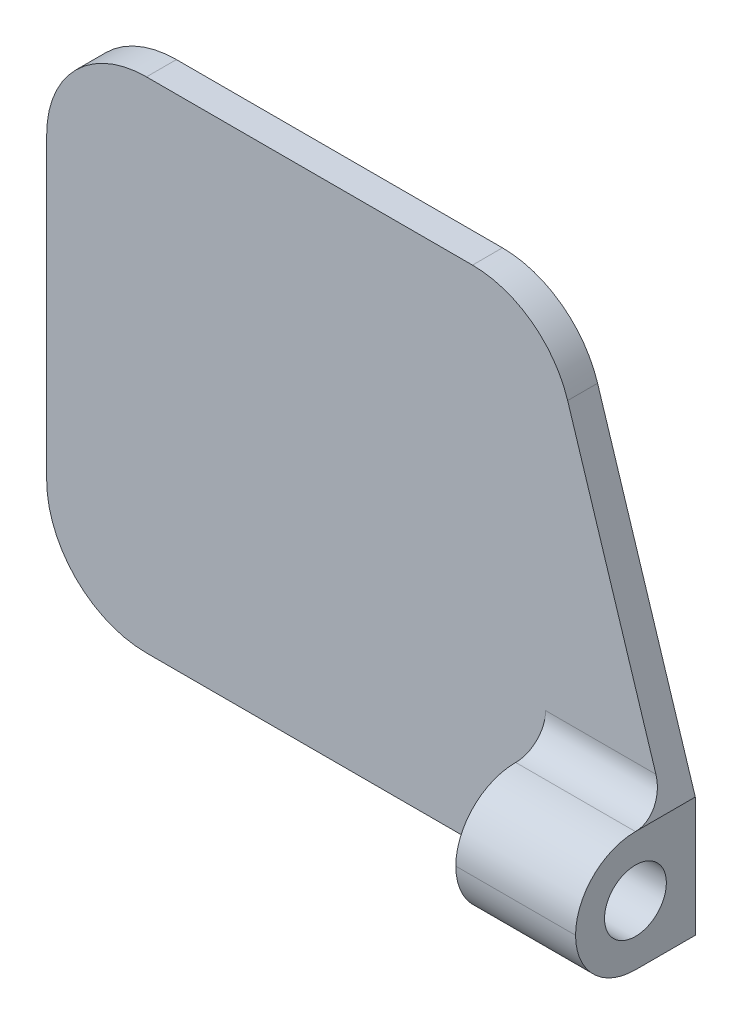
ISO-10303-21;
HEADER;
FILE_DESCRIPTION(('STEP AP214'),'2;1');
FILE_NAME('part.step','',(''),(''),'','','');
FILE_SCHEMA(('AUTOMOTIVE_DESIGN { 1 0 10303 214 1 1 1 1 }'));
ENDSEC;
DATA;
#1=APPLICATION_CONTEXT('core data for automotive mechanical design processes');
#2=APPLICATION_PROTOCOL_DEFINITION('international standard','automotive_design',2000,#1);
#3=PRODUCT_CONTEXT('',#1,'mechanical');
#4=PRODUCT('Part','Part','',(#3));
#5=PRODUCT_RELATED_PRODUCT_CATEGORY('part','',(#4));
#6=PRODUCT_DEFINITION_FORMATION('','',#4);
#7=PRODUCT_DEFINITION_CONTEXT('part definition',#1,'design');
#8=PRODUCT_DEFINITION('design','',#6,#7);
#9=PRODUCT_DEFINITION_SHAPE('','',#8);
#10=(LENGTH_UNIT() NAMED_UNIT(*) SI_UNIT(.MILLI.,.METRE.));
#11=(NAMED_UNIT(*) PLANE_ANGLE_UNIT() SI_UNIT($,.RADIAN.));
#12=(NAMED_UNIT(*) SI_UNIT($,.STERADIAN.) SOLID_ANGLE_UNIT());
#13=UNCERTAINTY_MEASURE_WITH_UNIT(LENGTH_MEASURE(1.E-05),#10,'distance_accuracy_value','');
#14=(GEOMETRIC_REPRESENTATION_CONTEXT(3) GLOBAL_UNCERTAINTY_ASSIGNED_CONTEXT((#13)) GLOBAL_UNIT_ASSIGNED_CONTEXT((#10,
#11,#12)) REPRESENTATION_CONTEXT('',''));
#15=CARTESIAN_POINT('',(0.,0.,0.));
#16=DIRECTION('',(0.,0.,1.));
#17=DIRECTION('',(1.,0.,0.));
#18=AXIS2_PLACEMENT_3D('',#15,#16,#17);
#19=CARTESIAN_POINT('',(0.,0.,3.));
#20=DIRECTION('',(0.,0.,-1.));
#21=DIRECTION('',(-1.,0.,0.));
#22=AXIS2_PLACEMENT_3D('',#19,#20,#21);
#23=PLANE('',#22);
#24=DIRECTION('',(0.,-1.,0.));
#25=VECTOR('',#24,1.);
#26=CARTESIAN_POINT('',(0.,0.,3.));
#27=LINE('',#26,#25);
#28=CARTESIAN_POINT('',(0.,40.,3.));
#29=VERTEX_POINT('',#28);
#30=CARTESIAN_POINT('',(0.,10.,3.));
#31=VERTEX_POINT('',#30);
#32=EDGE_CURVE('E156',#29,#31,#27,.T.);
#33=ORIENTED_EDGE('',*,*,#32,.T.);
#34=CARTESIAN_POINT('',(10.,10.,3.));
#35=DIRECTION('',(0.,0.,-1.));
#36=DIRECTION('',(-1.,0.,0.));
#37=AXIS2_PLACEMENT_3D('',#34,#35,#36);
#38=CIRCLE('',#37,10.);
#39=CARTESIAN_POINT('',(10.,0.,3.));
#40=VERTEX_POINT('',#39);
#41=EDGE_CURVE('E184',#31,#40,#38,.F.);
#42=ORIENTED_EDGE('',*,*,#41,.T.);
#43=DIRECTION('',(1.,0.,0.));
#44=VECTOR('',#43,1.);
#45=CARTESIAN_POINT('',(0.,0.,3.));
#46=LINE('',#45,#44);
#47=CARTESIAN_POINT('',(50.,0.,3.));
#48=VERTEX_POINT('',#47);
#49=EDGE_CURVE('E159',#40,#48,#46,.T.);
#50=ORIENTED_EDGE('',*,*,#49,.T.);
#51=DIRECTION('',(0.,-1.,0.));
#52=VECTOR('',#51,1.);
#53=CARTESIAN_POINT('',(50.,0.,3.));
#54=LINE('',#53,#52);
#55=CARTESIAN_POINT('',(50.,15.,3.));
#56=VERTEX_POINT('',#55);
#57=EDGE_CURVE('E195',#56,#48,#54,.T.);
#58=ORIENTED_EDGE('',*,*,#57,.F.);
#59=DIRECTION('',(-1.,0.,0.));
#60=VECTOR('',#59,1.);
#61=CARTESIAN_POINT('',(62.,15.,3.));
#62=LINE('',#61,#60);
#63=CARTESIAN_POINT('',(61.0526315789474,15.,3.));
#64=VERTEX_POINT('',#63);
#65=EDGE_CURVE('E216',#56,#64,#62,.F.);
#66=ORIENTED_EDGE('',*,*,#65,.T.);
#67=DIRECTION('',(-0.301131367937097,0.953582665134142,0.));
#68=VECTOR('',#67,1.);
#69=CARTESIAN_POINT('',(62.,12.,3.));
#70=LINE('',#69,#68);
#71=CARTESIAN_POINT('',(52.2069535749355,43.011313679371,3.));
#72=VERTEX_POINT('',#71);
#73=EDGE_CURVE('E146',#64,#72,#70,.T.);
#74=ORIENTED_EDGE('',*,*,#73,.T.);
#75=CARTESIAN_POINT('',(42.6711269235941,40.,3.));
#76=DIRECTION('',(0.,0.,-1.));
#77=DIRECTION('',(-1.,0.,0.));
#78=AXIS2_PLACEMENT_3D('',#75,#76,#77);
#79=CIRCLE('',#78,10.);
#80=CARTESIAN_POINT('',(42.6711269235941,50.,3.));
#81=VERTEX_POINT('',#80);
#82=EDGE_CURVE('E54',#72,#81,#79,.F.);
#83=ORIENTED_EDGE('',*,*,#82,.T.);
#84=DIRECTION('',(-1.,0.,0.));
#85=VECTOR('',#84,1.);
#86=CARTESIAN_POINT('',(0.,50.,3.));
#87=LINE('',#86,#85);
#88=CARTESIAN_POINT('',(10.,50.,3.));
#89=VERTEX_POINT('',#88);
#90=EDGE_CURVE('E162',#81,#89,#87,.T.);
#91=ORIENTED_EDGE('',*,*,#90,.T.);
#92=CARTESIAN_POINT('',(10.,40.,3.));
#93=DIRECTION('',(0.,0.,-1.));
#94=DIRECTION('',(-1.,0.,0.));
#95=AXIS2_PLACEMENT_3D('',#92,#93,#94);
#96=CIRCLE('',#95,10.);
#97=EDGE_CURVE('E182',#89,#29,#96,.F.);
#98=ORIENTED_EDGE('',*,*,#97,.T.);
#99=EDGE_LOOP('',(#33,#42,#50,#58,#66,#74,#83,#91,#98));
#100=FACE_BOUND('',#99,.T.);
#101=ADVANCED_FACE('F33',(#100),#23,.F.);
#102=CARTESIAN_POINT('',(0.,0.,3.));
#103=DIRECTION('',(1.,0.,0.));
#104=DIRECTION('',(0.,0.,-1.));
#105=AXIS2_PLACEMENT_3D('',#102,#103,#104);
#106=PLANE('',#105);
#107=DIRECTION('',(0.,-1.,0.));
#108=VECTOR('',#107,1.);
#109=CARTESIAN_POINT('',(0.,0.,0.));
#110=LINE('',#109,#108);
#111=CARTESIAN_POINT('',(0.,40.,0.));
#112=VERTEX_POINT('',#111);
#113=CARTESIAN_POINT('',(0.,10.,0.));
#114=VERTEX_POINT('',#113);
#115=EDGE_CURVE('E132',#112,#114,#110,.T.);
#116=ORIENTED_EDGE('',*,*,#115,.T.);
#117=DIRECTION('',(0.,0.,-1.));
#118=VECTOR('',#117,1.);
#119=CARTESIAN_POINT('',(0.,10.,3.));
#120=LINE('',#119,#118);
#121=EDGE_CURVE('E179',#114,#31,#120,.F.);
#122=ORIENTED_EDGE('',*,*,#121,.T.);
#123=ORIENTED_EDGE('',*,*,#32,.F.);
#124=DIRECTION('',(0.,0.,-1.));
#125=VECTOR('',#124,1.);
#126=CARTESIAN_POINT('',(0.,40.,3.));
#127=LINE('',#126,#125);
#128=EDGE_CURVE('E176',#29,#112,#127,.T.);
#129=ORIENTED_EDGE('',*,*,#128,.T.);
#130=EDGE_LOOP('',(#116,#122,#123,#129));
#131=FACE_BOUND('',#130,.T.);
#132=ADVANCED_FACE('F245',(#131),#106,.F.);
#133=CARTESIAN_POINT('',(0.,0.,3.));
#134=DIRECTION('',(0.,1.,0.));
#135=DIRECTION('',(0.,0.,1.));
#136=AXIS2_PLACEMENT_3D('',#133,#134,#135);
#137=PLANE('',#136);
#138=ORIENTED_EDGE('',*,*,#49,.F.);
#139=DIRECTION('',(0.,0.,-1.));
#140=VECTOR('',#139,1.);
#141=CARTESIAN_POINT('',(10.,0.,3.));
#142=LINE('',#141,#140);
#143=CARTESIAN_POINT('',(10.,0.,0.));
#144=VERTEX_POINT('',#143);
#145=EDGE_CURVE('E128',#40,#144,#142,.T.);
#146=ORIENTED_EDGE('',*,*,#145,.T.);
#147=DIRECTION('',(1.,0.,0.));
#148=VECTOR('',#147,1.);
#149=CARTESIAN_POINT('',(0.,0.,0.));
#150=LINE('',#149,#148);
#151=CARTESIAN_POINT('',(62.,0.,0.));
#152=VERTEX_POINT('',#151);
#153=EDGE_CURVE('E120',#144,#152,#150,.T.);
#154=ORIENTED_EDGE('',*,*,#153,.T.);
#155=DIRECTION('',(0.,0.,1.));
#156=VECTOR('',#155,1.);
#157=CARTESIAN_POINT('',(62.,0.,0.));
#158=LINE('',#157,#156);
#159=CARTESIAN_POINT('',(62.,0.,6.));
#160=VERTEX_POINT('',#159);
#161=EDGE_CURVE('E125',#152,#160,#158,.T.);
#162=ORIENTED_EDGE('',*,*,#161,.T.);
#163=DIRECTION('',(1.,0.,0.));
#164=VECTOR('',#163,1.);
#165=CARTESIAN_POINT('',(50.,0.,6.));
#166=LINE('',#165,#164);
#167=CARTESIAN_POINT('',(50.,0.,6.));
#168=VERTEX_POINT('',#167);
#169=EDGE_CURVE('E206',#160,#168,#166,.F.);
#170=ORIENTED_EDGE('',*,*,#169,.T.);
#171=DIRECTION('',(0.,0.,-1.));
#172=VECTOR('',#171,1.);
#173=CARTESIAN_POINT('',(50.,0.,12.));
#174=LINE('',#173,#172);
#175=EDGE_CURVE('E149',#168,#48,#174,.T.);
#176=ORIENTED_EDGE('',*,*,#175,.T.);
#177=EDGE_LOOP('',(#138,#146,#154,#162,#170,#176));
#178=FACE_BOUND('',#177,.T.);
#179=ADVANCED_FACE('F123',(#178),#137,.F.);
#180=CARTESIAN_POINT('',(0.,50.,3.));
#181=DIRECTION('',(0.,-1.,0.));
#182=DIRECTION('',(0.,0.,-1.));
#183=AXIS2_PLACEMENT_3D('',#180,#181,#182);
#184=PLANE('',#183);
#185=DIRECTION('',(-1.,0.,0.));
#186=VECTOR('',#185,1.);
#187=CARTESIAN_POINT('',(0.,50.,0.));
#188=LINE('',#187,#186);
#189=CARTESIAN_POINT('',(42.6711269235941,50.,0.));
#190=VERTEX_POINT('',#189);
#191=CARTESIAN_POINT('',(10.,50.,0.));
#192=VERTEX_POINT('',#191);
#193=EDGE_CURVE('E131',#190,#192,#188,.T.);
#194=ORIENTED_EDGE('',*,*,#193,.T.);
#195=DIRECTION('',(0.,0.,-1.));
#196=VECTOR('',#195,1.);
#197=CARTESIAN_POINT('',(10.,50.,3.));
#198=LINE('',#197,#196);
#199=EDGE_CURVE('E41',#192,#89,#198,.F.);
#200=ORIENTED_EDGE('',*,*,#199,.T.);
#201=ORIENTED_EDGE('',*,*,#90,.F.);
#202=DIRECTION('',(0.,0.,-1.));
#203=VECTOR('',#202,1.);
#204=CARTESIAN_POINT('',(42.6711269235941,50.,0.));
#205=LINE('',#204,#203);
#206=EDGE_CURVE('E186',#81,#190,#205,.T.);
#207=ORIENTED_EDGE('',*,*,#206,.T.);
#208=EDGE_LOOP('',(#194,#200,#201,#207));
#209=FACE_BOUND('',#208,.T.);
#210=ADVANCED_FACE('F190',(#209),#184,.F.);
#211=CARTESIAN_POINT('',(0.,0.,0.));
#212=DIRECTION('',(0.,0.,-1.));
#213=DIRECTION('',(-1.,0.,0.));
#214=AXIS2_PLACEMENT_3D('',#211,#212,#213);
#215=PLANE('',#214);
#216=ORIENTED_EDGE('',*,*,#153,.F.);
#217=CARTESIAN_POINT('',(10.,10.,0.));
#218=DIRECTION('',(0.,0.,-1.));
#219=DIRECTION('',(-1.,0.,0.));
#220=AXIS2_PLACEMENT_3D('',#217,#218,#219);
#221=CIRCLE('',#220,10.);
#222=EDGE_CURVE('E174',#144,#114,#221,.T.);
#223=ORIENTED_EDGE('',*,*,#222,.T.);
#224=ORIENTED_EDGE('',*,*,#115,.F.);
#225=CARTESIAN_POINT('',(10.,40.,0.));
#226=DIRECTION('',(0.,0.,-1.));
#227=DIRECTION('',(-1.,0.,0.));
#228=AXIS2_PLACEMENT_3D('',#225,#226,#227);
#229=CIRCLE('',#228,10.);
#230=EDGE_CURVE('E172',#112,#192,#229,.T.);
#231=ORIENTED_EDGE('',*,*,#230,.T.);
#232=ORIENTED_EDGE('',*,*,#193,.F.);
#233=CARTESIAN_POINT('',(42.6711269235941,40.,0.));
#234=DIRECTION('',(0.,0.,-1.));
#235=DIRECTION('',(-1.,0.,0.));
#236=AXIS2_PLACEMENT_3D('',#233,#234,#235);
#237=CIRCLE('',#236,10.);
#238=CARTESIAN_POINT('',(52.2069535749355,43.011313679371,0.));
#239=VERTEX_POINT('',#238);
#240=EDGE_CURVE('E170',#190,#239,#237,.T.);
#241=ORIENTED_EDGE('',*,*,#240,.T.);
#242=DIRECTION('',(-0.301131367937097,0.953582665134142,0.));
#243=VECTOR('',#242,1.);
#244=CARTESIAN_POINT('',(62.,12.,0.));
#245=LINE('',#244,#243);
#246=CARTESIAN_POINT('',(62.,12.,0.));
#247=VERTEX_POINT('',#246);
#248=EDGE_CURVE('E142',#247,#239,#245,.T.);
#249=ORIENTED_EDGE('',*,*,#248,.F.);
#250=DIRECTION('',(0.,1.,0.));
#251=VECTOR('',#250,1.);
#252=CARTESIAN_POINT('',(62.,0.,0.));
#253=LINE('',#252,#251);
#254=EDGE_CURVE('E137',#152,#247,#253,.T.);
#255=ORIENTED_EDGE('',*,*,#254,.F.);
#256=EDGE_LOOP('',(#216,#223,#224,#231,#232,#241,#249,#255));
#257=FACE_BOUND('',#256,.T.);
#258=ADVANCED_FACE('F144',(#257),#215,.T.);
#259=CARTESIAN_POINT('',(62.,12.,0.));
#260=DIRECTION('',(0.953582665134142,0.301131367937097,0.));
#261=DIRECTION('',(-0.301131367937097,0.953582665134142,0.));
#262=AXIS2_PLACEMENT_3D('',#259,#260,#261);
#263=PLANE('',#262);
#264=ORIENTED_EDGE('',*,*,#248,.T.);
#265=DIRECTION('',(0.,0.,-1.));
#266=VECTOR('',#265,1.);
#267=CARTESIAN_POINT('',(52.2069535749355,43.011313679371,3.));
#268=LINE('',#267,#266);
#269=EDGE_CURVE('E11',#239,#72,#268,.F.);
#270=ORIENTED_EDGE('',*,*,#269,.T.);
#271=ORIENTED_EDGE('',*,*,#73,.F.);
#272=CARTESIAN_POINT('',(61.0526315789474,15.,6.));
#273=DIRECTION('',(0.953582665134142,0.301131367937097,0.));
#274=DIRECTION('',(0.301131367937097,-0.953582665134142,0.));
#275=AXIS2_PLACEMENT_3D('',#272,#273,#274);
#276=ELLIPSE('',#275,3.14603034397441,3.);
#277=CARTESIAN_POINT('',(62.,12.,6.));
#278=VERTEX_POINT('',#277);
#279=EDGE_CURVE('E167',#64,#278,#276,.F.);
#280=ORIENTED_EDGE('',*,*,#279,.T.);
#281=DIRECTION('',(0.,0.,1.));
#282=VECTOR('',#281,1.);
#283=CARTESIAN_POINT('',(62.,12.,0.));
#284=LINE('',#283,#282);
#285=EDGE_CURVE('E141',#247,#278,#284,.T.);
#286=ORIENTED_EDGE('',*,*,#285,.F.);
#287=EDGE_LOOP('',(#264,#270,#271,#280,#286));
#288=FACE_BOUND('',#287,.T.);
#289=ADVANCED_FACE('F229',(#288),#263,.T.);
#290=CARTESIAN_POINT('',(62.,0.,0.));
#291=DIRECTION('',(1.,0.,0.));
#292=DIRECTION('',(0.,0.,-1.));
#293=AXIS2_PLACEMENT_3D('',#290,#291,#292);
#294=PLANE('',#293);
#295=CARTESIAN_POINT('',(62.,6.,6.));
#296=DIRECTION('',(1.,0.,0.));
#297=DIRECTION('',(0.,0.,-1.));
#298=AXIS2_PLACEMENT_3D('',#295,#296,#297);
#299=CIRCLE('',#298,3.1);
#300=CARTESIAN_POINT('',(62.,6.,2.9));
#301=VERTEX_POINT('',#300);
#302=EDGE_CURVE('E220',#301,#301,#299,.T.);
#303=ORIENTED_EDGE('',*,*,#302,.F.);
#304=EDGE_LOOP('',(#303));
#305=FACE_BOUND('',#304,.T.);
#306=CARTESIAN_POINT('',(62.,6.,6.));
#307=DIRECTION('',(1.,0.,0.));
#308=DIRECTION('',(0.,0.,-1.));
#309=AXIS2_PLACEMENT_3D('',#306,#307,#308);
#310=CIRCLE('',#309,6.);
#311=CARTESIAN_POINT('',(62.,6.,12.));
#312=VERTEX_POINT('',#311);
#313=EDGE_CURVE('E201',#278,#312,#310,.T.);
#314=ORIENTED_EDGE('',*,*,#313,.T.);
#315=CARTESIAN_POINT('',(62.,6.,6.));
#316=DIRECTION('',(1.,0.,0.));
#317=DIRECTION('',(0.,0.,-1.));
#318=AXIS2_PLACEMENT_3D('',#315,#316,#317);
#319=CIRCLE('',#318,6.);
#320=EDGE_CURVE('E140',#312,#160,#319,.T.);
#321=ORIENTED_EDGE('',*,*,#320,.T.);
#322=ORIENTED_EDGE('',*,*,#161,.F.);
#323=ORIENTED_EDGE('',*,*,#254,.T.);
#324=ORIENTED_EDGE('',*,*,#285,.T.);
#325=EDGE_LOOP('',(#314,#321,#322,#323,#324));
#326=FACE_BOUND('',#325,.T.);
#327=ADVANCED_FACE('F136',(#305,#326),#294,.T.);
#328=CARTESIAN_POINT('',(50.,0.,12.));
#329=DIRECTION('',(1.,0.,0.));
#330=DIRECTION('',(0.,0.,-1.));
#331=AXIS2_PLACEMENT_3D('',#328,#329,#330);
#332=PLANE('',#331);
#333=ORIENTED_EDGE('',*,*,#175,.F.);
#334=CARTESIAN_POINT('',(50.,6.,6.));
#335=DIRECTION('',(1.,0.,0.));
#336=DIRECTION('',(0.,0.,-1.));
#337=AXIS2_PLACEMENT_3D('',#334,#335,#336);
#338=CIRCLE('',#337,6.);
#339=CARTESIAN_POINT('',(50.,6.,12.));
#340=VERTEX_POINT('',#339);
#341=EDGE_CURVE('E211',#168,#340,#338,.F.);
#342=ORIENTED_EDGE('',*,*,#341,.T.);
#343=CARTESIAN_POINT('',(50.,6.,6.));
#344=DIRECTION('',(1.,0.,0.));
#345=DIRECTION('',(0.,0.,-1.));
#346=AXIS2_PLACEMENT_3D('',#343,#344,#345);
#347=CIRCLE('',#346,6.);
#348=CARTESIAN_POINT('',(50.,12.,6.));
#349=VERTEX_POINT('',#348);
#350=EDGE_CURVE('E208',#340,#349,#347,.F.);
#351=ORIENTED_EDGE('',*,*,#350,.T.);
#352=CARTESIAN_POINT('',(50.,15.,6.));
#353=DIRECTION('',(1.,0.,0.));
#354=DIRECTION('',(0.,0.,-1.));
#355=AXIS2_PLACEMENT_3D('',#352,#353,#354);
#356=CIRCLE('',#355,3.);
#357=EDGE_CURVE('E221',#349,#56,#356,.T.);
#358=ORIENTED_EDGE('',*,*,#357,.T.);
#359=ORIENTED_EDGE('',*,*,#57,.T.);
#360=EDGE_LOOP('',(#333,#342,#351,#358,#359));
#361=FACE_BOUND('',#360,.T.);
#362=ADVANCED_FACE('F251',(#361),#332,.F.);
#363=CARTESIAN_POINT('',(52.,6.,6.));
#364=DIRECTION('',(1.,0.,0.));
#365=DIRECTION('',(0.,0.,-1.));
#366=AXIS2_PLACEMENT_3D('',#363,#364,#365);
#367=CYLINDRICAL_SURFACE('',#366,3.1);
#368=CARTESIAN_POINT('',(52.,6.,6.));
#369=DIRECTION('',(1.,0.,0.));
#370=DIRECTION('',(0.,0.,-1.));
#371=AXIS2_PLACEMENT_3D('',#368,#369,#370);
#372=CIRCLE('',#371,3.1);
#373=CARTESIAN_POINT('',(52.,6.,2.9));
#374=VERTEX_POINT('',#373);
#375=EDGE_CURVE('E198',#374,#374,#372,.T.);
#376=ORIENTED_EDGE('',*,*,#375,.F.);
#377=EDGE_LOOP('',(#376));
#378=FACE_BOUND('',#377,.T.);
#379=ORIENTED_EDGE('',*,*,#302,.T.);
#380=EDGE_LOOP('',(#379));
#381=FACE_BOUND('',#380,.T.);
#382=ADVANCED_FACE('F323',(#378,#381),#367,.F.);
#383=CARTESIAN_POINT('',(52.,6.,6.));
#384=DIRECTION('',(1.,0.,0.));
#385=DIRECTION('',(0.,0.,-1.));
#386=AXIS2_PLACEMENT_3D('',#383,#384,#385);
#387=PLANE('',#386);
#388=ORIENTED_EDGE('',*,*,#375,.T.);
#389=EDGE_LOOP('',(#388));
#390=FACE_BOUND('',#389,.T.);
#391=ADVANCED_FACE('F278',(#390),#387,.T.);
#392=CARTESIAN_POINT('',(0.,5.99999999999999,6.));
#393=DIRECTION('',(1.,0.,0.));
#394=DIRECTION('',(0.,1.,0.));
#395=AXIS2_PLACEMENT_3D('',#392,#393,#394);
#396=CYLINDRICAL_SURFACE('',#395,6.);
#397=DIRECTION('',(-1.,0.,0.));
#398=VECTOR('',#397,1.);
#399=CARTESIAN_POINT('',(62.,12.,6.));
#400=LINE('',#399,#398);
#401=EDGE_CURVE('E213',#349,#278,#400,.F.);
#402=ORIENTED_EDGE('',*,*,#401,.F.);
#403=ORIENTED_EDGE('',*,*,#350,.F.);
#404=DIRECTION('',(-1.,0.,0.));
#405=VECTOR('',#404,1.);
#406=CARTESIAN_POINT('',(50.,6.,12.));
#407=LINE('',#406,#405);
#408=EDGE_CURVE('E217',#312,#340,#407,.T.);
#409=ORIENTED_EDGE('',*,*,#408,.F.);
#410=ORIENTED_EDGE('',*,*,#313,.F.);
#411=EDGE_LOOP('',(#402,#403,#409,#410));
#412=FACE_BOUND('',#411,.T.);
#413=ADVANCED_FACE('F236',(#412),#396,.T.);
#414=CARTESIAN_POINT('',(0.,6.,6.));
#415=DIRECTION('',(-1.,0.,0.));
#416=DIRECTION('',(0.,0.,1.));
#417=AXIS2_PLACEMENT_3D('',#414,#415,#416);
#418=CYLINDRICAL_SURFACE('',#417,6.);
#419=ORIENTED_EDGE('',*,*,#341,.F.);
#420=ORIENTED_EDGE('',*,*,#169,.F.);
#421=ORIENTED_EDGE('',*,*,#320,.F.);
#422=ORIENTED_EDGE('',*,*,#408,.T.);
#423=EDGE_LOOP('',(#419,#420,#421,#422));
#424=FACE_BOUND('',#423,.T.);
#425=ADVANCED_FACE('F272',(#424),#418,.T.);
#426=CARTESIAN_POINT('',(62.,15.,6.));
#427=DIRECTION('',(1.,0.,0.));
#428=DIRECTION('',(0.,1.,0.));
#429=AXIS2_PLACEMENT_3D('',#426,#427,#428);
#430=CYLINDRICAL_SURFACE('',#429,3.);
#431=ORIENTED_EDGE('',*,*,#279,.F.);
#432=ORIENTED_EDGE('',*,*,#65,.F.);
#433=ORIENTED_EDGE('',*,*,#357,.F.);
#434=ORIENTED_EDGE('',*,*,#401,.T.);
#435=EDGE_LOOP('',(#431,#432,#433,#434));
#436=FACE_BOUND('',#435,.T.);
#437=ADVANCED_FACE('F232',(#436),#430,.F.);
#438=CARTESIAN_POINT('',(10.,10.,3.));
#439=DIRECTION('',(0.,0.,-1.));
#440=DIRECTION('',(-1.,0.,0.));
#441=AXIS2_PLACEMENT_3D('',#438,#439,#440);
#442=CYLINDRICAL_SURFACE('',#441,10.);
#443=ORIENTED_EDGE('',*,*,#41,.F.);
#444=ORIENTED_EDGE('',*,*,#121,.F.);
#445=ORIENTED_EDGE('',*,*,#222,.F.);
#446=ORIENTED_EDGE('',*,*,#145,.F.);
#447=EDGE_LOOP('',(#443,#444,#445,#446));
#448=FACE_BOUND('',#447,.T.);
#449=ADVANCED_FACE('F249',(#448),#442,.T.);
#450=CARTESIAN_POINT('',(10.,40.,3.));
#451=DIRECTION('',(0.,0.,-1.));
#452=DIRECTION('',(-1.,0.,0.));
#453=AXIS2_PLACEMENT_3D('',#450,#451,#452);
#454=CYLINDRICAL_SURFACE('',#453,10.);
#455=ORIENTED_EDGE('',*,*,#97,.F.);
#456=ORIENTED_EDGE('',*,*,#199,.F.);
#457=ORIENTED_EDGE('',*,*,#230,.F.);
#458=ORIENTED_EDGE('',*,*,#128,.F.);
#459=EDGE_LOOP('',(#455,#456,#457,#458));
#460=FACE_BOUND('',#459,.T.);
#461=ADVANCED_FACE('F242',(#460),#454,.T.);
#462=CARTESIAN_POINT('',(42.6711269235941,40.,3.));
#463=DIRECTION('',(0.,0.,1.));
#464=DIRECTION('',(1.,0.,0.));
#465=AXIS2_PLACEMENT_3D('',#462,#463,#464);
#466=CYLINDRICAL_SURFACE('',#465,10.);
#467=ORIENTED_EDGE('',*,*,#82,.F.);
#468=ORIENTED_EDGE('',*,*,#269,.F.);
#469=ORIENTED_EDGE('',*,*,#240,.F.);
#470=ORIENTED_EDGE('',*,*,#206,.F.);
#471=EDGE_LOOP('',(#467,#468,#469,#470));
#472=FACE_BOUND('',#471,.T.);
#473=ADVANCED_FACE('F35',(#472),#466,.T.);
#474=CLOSED_SHELL('',(#101,#132,#179,#210,#258,#289,#327,#362,#382,#391,#413,#425,#437,#449,
#461,#473));
#475=MANIFOLD_SOLID_BREP('B2',#474);
#476=ADVANCED_BREP_SHAPE_REPRESENTATION('',(#18,#475),#14);
#477=SHAPE_DEFINITION_REPRESENTATION(#9,#476);
ENDSEC;
END-ISO-10303-21;
